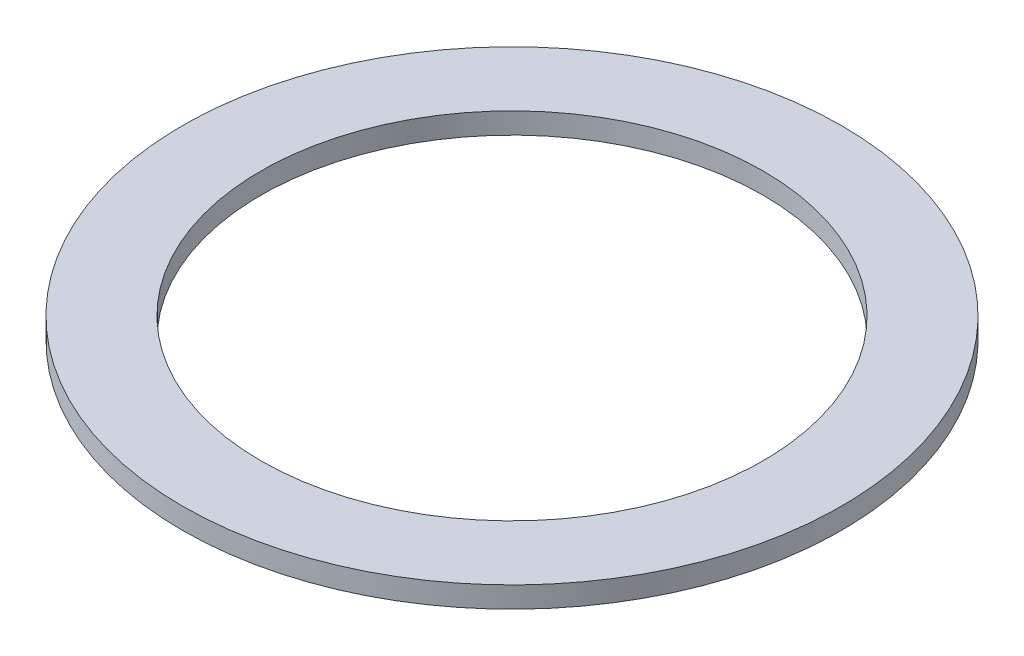
ISO-10303-21;
HEADER;
FILE_DESCRIPTION(('STEP AP214'),'2;1');
FILE_NAME('part.step','',(''),(''),'','','');
FILE_SCHEMA(('AUTOMOTIVE_DESIGN { 1 0 10303 214 1 1 1 1 }'));
ENDSEC;
DATA;
#1=APPLICATION_CONTEXT('core data for automotive mechanical design processes');
#2=APPLICATION_PROTOCOL_DEFINITION('international standard','automotive_design',2000,#1);
#3=PRODUCT_CONTEXT('',#1,'mechanical');
#4=PRODUCT('Part','Part','',(#3));
#5=PRODUCT_RELATED_PRODUCT_CATEGORY('part','',(#4));
#6=PRODUCT_DEFINITION_FORMATION('','',#4);
#7=PRODUCT_DEFINITION_CONTEXT('part definition',#1,'design');
#8=PRODUCT_DEFINITION('design','',#6,#7);
#9=PRODUCT_DEFINITION_SHAPE('','',#8);
#10=(LENGTH_UNIT() NAMED_UNIT(*) SI_UNIT(.MILLI.,.METRE.));
#11=(NAMED_UNIT(*) PLANE_ANGLE_UNIT() SI_UNIT($,.RADIAN.));
#12=(NAMED_UNIT(*) SI_UNIT($,.STERADIAN.) SOLID_ANGLE_UNIT());
#13=UNCERTAINTY_MEASURE_WITH_UNIT(LENGTH_MEASURE(1.E-05),#10,'distance_accuracy_value','');
#14=(GEOMETRIC_REPRESENTATION_CONTEXT(3) GLOBAL_UNCERTAINTY_ASSIGNED_CONTEXT((#13)) GLOBAL_UNIT_ASSIGNED_CONTEXT((#10,
#11,#12)) REPRESENTATION_CONTEXT('',''));
#15=CARTESIAN_POINT('',(0.,0.,0.));
#16=DIRECTION('',(0.,0.,1.));
#17=DIRECTION('',(1.,0.,0.));
#18=AXIS2_PLACEMENT_3D('',#15,#16,#17);
#19=CARTESIAN_POINT('',(0.,6.7,0.));
#20=DIRECTION('',(0.,1.,0.));
#21=DIRECTION('',(0.,0.,1.));
#22=AXIS2_PLACEMENT_3D('',#19,#20,#21);
#23=PLANE('',#22);
#24=CARTESIAN_POINT('',(0.,6.7,0.));
#25=DIRECTION('',(0.,1.,0.));
#26=DIRECTION('',(0.,0.,1.));
#27=AXIS2_PLACEMENT_3D('',#24,#25,#26);
#28=CIRCLE('',#27,105.);
#29=CARTESIAN_POINT('',(0.,6.7,105.));
#30=VERTEX_POINT('',#29);
#31=EDGE_CURVE('E10',#30,#30,#28,.T.);
#32=ORIENTED_EDGE('',*,*,#31,.T.);
#33=EDGE_LOOP('',(#32));
#34=FACE_BOUND('',#33,.T.);
#35=CARTESIAN_POINT('',(0.,6.7,0.));
#36=DIRECTION('',(0.,1.,0.));
#37=DIRECTION('',(0.,0.,1.));
#38=AXIS2_PLACEMENT_3D('',#35,#36,#37);
#39=CIRCLE('',#38,80.);
#40=CARTESIAN_POINT('',(0.,6.7,80.));
#41=VERTEX_POINT('',#40);
#42=EDGE_CURVE('E41',#41,#41,#39,.T.);
#43=ORIENTED_EDGE('',*,*,#42,.F.);
#44=EDGE_LOOP('',(#43));
#45=FACE_BOUND('',#44,.T.);
#46=ADVANCED_FACE('F30',(#34,#45),#23,.T.);
#47=CARTESIAN_POINT('',(0.,0.,0.));
#48=DIRECTION('',(0.,1.,0.));
#49=DIRECTION('',(0.,0.,1.));
#50=AXIS2_PLACEMENT_3D('',#47,#48,#49);
#51=PLANE('',#50);
#52=CARTESIAN_POINT('',(0.,0.,0.));
#53=DIRECTION('',(0.,1.,0.));
#54=DIRECTION('',(0.,0.,1.));
#55=AXIS2_PLACEMENT_3D('',#52,#53,#54);
#56=CIRCLE('',#55,105.);
#57=CARTESIAN_POINT('',(0.,0.,105.));
#58=VERTEX_POINT('',#57);
#59=EDGE_CURVE('E34',#58,#58,#56,.T.);
#60=ORIENTED_EDGE('',*,*,#59,.F.);
#61=EDGE_LOOP('',(#60));
#62=FACE_BOUND('',#61,.T.);
#63=CARTESIAN_POINT('',(0.,0.,0.));
#64=DIRECTION('',(0.,1.,0.));
#65=DIRECTION('',(0.,0.,1.));
#66=AXIS2_PLACEMENT_3D('',#63,#64,#65);
#67=CIRCLE('',#66,80.);
#68=CARTESIAN_POINT('',(0.,0.,80.));
#69=VERTEX_POINT('',#68);
#70=EDGE_CURVE('E43',#69,#69,#67,.T.);
#71=ORIENTED_EDGE('',*,*,#70,.T.);
#72=EDGE_LOOP('',(#71));
#73=FACE_BOUND('',#72,.T.);
#74=ADVANCED_FACE('F53',(#62,#73),#51,.F.);
#75=CARTESIAN_POINT('',(0.,6.7,0.));
#76=DIRECTION('',(0.,-1.,0.));
#77=DIRECTION('',(0.,0.,-1.));
#78=AXIS2_PLACEMENT_3D('',#75,#76,#77);
#79=CYLINDRICAL_SURFACE('',#78,105.);
#80=ORIENTED_EDGE('',*,*,#31,.F.);
#81=EDGE_LOOP('',(#80));
#82=FACE_BOUND('',#81,.T.);
#83=ORIENTED_EDGE('',*,*,#59,.T.);
#84=EDGE_LOOP('',(#83));
#85=FACE_BOUND('',#84,.T.);
#86=ADVANCED_FACE('F32',(#82,#85),#79,.T.);
#87=CARTESIAN_POINT('',(0.,6.7,0.));
#88=DIRECTION('',(0.,-1.,0.));
#89=DIRECTION('',(0.,0.,-1.));
#90=AXIS2_PLACEMENT_3D('',#87,#88,#89);
#91=CYLINDRICAL_SURFACE('',#90,80.);
#92=ORIENTED_EDGE('',*,*,#42,.T.);
#93=EDGE_LOOP('',(#92));
#94=FACE_BOUND('',#93,.T.);
#95=ORIENTED_EDGE('',*,*,#70,.F.);
#96=EDGE_LOOP('',(#95));
#97=FACE_BOUND('',#96,.T.);
#98=ADVANCED_FACE('F49',(#94,#97),#91,.F.);
#99=CLOSED_SHELL('',(#46,#74,#86,#98));
#100=MANIFOLD_SOLID_BREP('B2',#99);
#101=ADVANCED_BREP_SHAPE_REPRESENTATION('',(#18,#100),#14);
#102=SHAPE_DEFINITION_REPRESENTATION(#9,#101);
ENDSEC;
END-ISO-10303-21;
